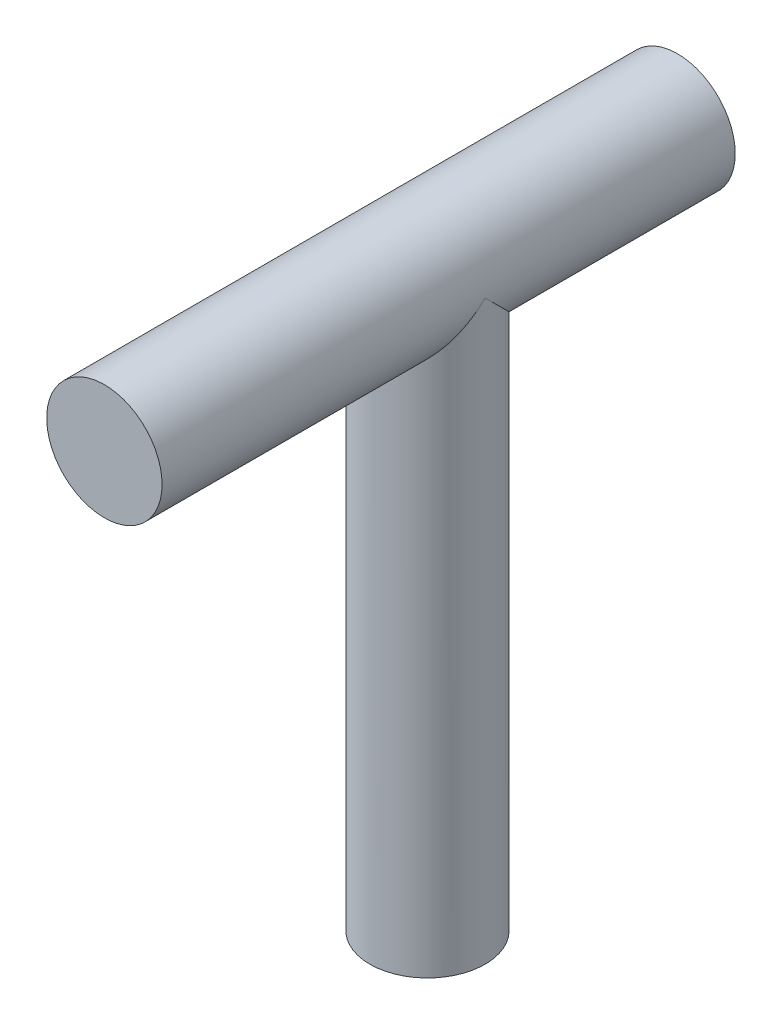
ISO-10303-21;
HEADER;
FILE_DESCRIPTION(('STEP AP214'),'2;1');
FILE_NAME('part.step','',(''),(''),'','','');
FILE_SCHEMA(('AUTOMOTIVE_DESIGN { 1 0 10303 214 1 1 1 1 }'));
ENDSEC;
DATA;
#1=APPLICATION_CONTEXT('core data for automotive mechanical design processes');
#2=APPLICATION_PROTOCOL_DEFINITION('international standard','automotive_design',2000,#1);
#3=PRODUCT_CONTEXT('',#1,'mechanical');
#4=PRODUCT('Part','Part','',(#3));
#5=PRODUCT_RELATED_PRODUCT_CATEGORY('part','',(#4));
#6=PRODUCT_DEFINITION_FORMATION('','',#4);
#7=PRODUCT_DEFINITION_CONTEXT('part definition',#1,'design');
#8=PRODUCT_DEFINITION('design','',#6,#7);
#9=PRODUCT_DEFINITION_SHAPE('','',#8);
#10=(LENGTH_UNIT() NAMED_UNIT(*) SI_UNIT(.MILLI.,.METRE.));
#11=(NAMED_UNIT(*) PLANE_ANGLE_UNIT() SI_UNIT($,.RADIAN.));
#12=(NAMED_UNIT(*) SI_UNIT($,.STERADIAN.) SOLID_ANGLE_UNIT());
#13=UNCERTAINTY_MEASURE_WITH_UNIT(LENGTH_MEASURE(1.E-05),#10,'distance_accuracy_value','');
#14=(GEOMETRIC_REPRESENTATION_CONTEXT(3) GLOBAL_UNCERTAINTY_ASSIGNED_CONTEXT((#13)) GLOBAL_UNIT_ASSIGNED_CONTEXT((#10,
#11,#12)) REPRESENTATION_CONTEXT('',''));
#15=CARTESIAN_POINT('',(0.,0.,0.));
#16=DIRECTION('',(0.,0.,1.));
#17=DIRECTION('',(1.,0.,0.));
#18=AXIS2_PLACEMENT_3D('',#15,#16,#17);
#19=CARTESIAN_POINT('',(0.,150.,-64.9999999999999));
#20=DIRECTION('',(0.,0.,1.));
#21=DIRECTION('',(1.,0.,0.));
#22=AXIS2_PLACEMENT_3D('',#19,#20,#21);
#23=CYLINDRICAL_SURFACE('',#22,15.);
#24=CARTESIAN_POINT('',(0.,150.,84.));
#25=DIRECTION('',(0.,0.,1.));
#26=DIRECTION('',(1.,0.,0.));
#27=AXIS2_PLACEMENT_3D('',#24,#25,#26);
#28=CIRCLE('',#27,15.);
#29=CARTESIAN_POINT('',(15.,150.,84.));
#30=VERTEX_POINT('',#29);
#31=EDGE_CURVE('E66',#30,#30,#28,.T.);
#32=ORIENTED_EDGE('',*,*,#31,.F.);
#33=EDGE_LOOP('',(#32));
#34=FACE_BOUND('',#33,.T.);
#35=CARTESIAN_POINT('',(0.,150.,-64.9999999999999));
#36=DIRECTION('',(0.,0.,1.));
#37=DIRECTION('',(1.,0.,0.));
#38=AXIS2_PLACEMENT_3D('',#35,#36,#37);
#39=CIRCLE('',#38,15.);
#40=CARTESIAN_POINT('',(15.,150.,-64.9999999999999));
#41=VERTEX_POINT('',#40);
#42=EDGE_CURVE('E58',#41,#41,#39,.T.);
#43=ORIENTED_EDGE('',*,*,#42,.T.);
#44=EDGE_LOOP('',(#43));
#45=FACE_BOUND('',#44,.T.);
#46=CARTESIAN_POINT('',(0.,150.,0.));
#47=DIRECTION('',(0.,-0.707106781186547,0.707106781186547));
#48=DIRECTION('',(0.,-0.707106781186547,-0.707106781186547));
#49=AXIS2_PLACEMENT_3D('',#46,#47,#48);
#50=ELLIPSE('',#49,21.2132034355964,15.);
#51=CARTESIAN_POINT('',(-15.,150.,0.));
#52=VERTEX_POINT('',#51);
#53=CARTESIAN_POINT('',(15.,150.,0.));
#54=VERTEX_POINT('',#53);
#55=EDGE_CURVE('E48',#52,#54,#50,.T.);
#56=ORIENTED_EDGE('',*,*,#55,.F.);
#57=CARTESIAN_POINT('',(0.,150.,0.));
#58=DIRECTION('',(0.,-0.707106781186547,-0.707106781186547));
#59=DIRECTION('',(0.,-0.707106781186547,0.707106781186547));
#60=AXIS2_PLACEMENT_3D('',#57,#58,#59);
#61=ELLIPSE('',#60,21.2132034355964,15.);
#62=EDGE_CURVE('E55',#54,#52,#61,.T.);
#63=ORIENTED_EDGE('',*,*,#62,.F.);
#64=EDGE_LOOP('',(#56,#63));
#65=FACE_BOUND('',#64,.T.);
#66=ADVANCED_FACE('F39',(#34,#45,#65),#23,.T.);
#67=CARTESIAN_POINT('',(0.,150.,-64.9999999999999));
#68=DIRECTION('',(0.,0.,1.));
#69=DIRECTION('',(1.,0.,0.));
#70=AXIS2_PLACEMENT_3D('',#67,#68,#69);
#71=PLANE('',#70);
#72=ORIENTED_EDGE('',*,*,#42,.F.);
#73=EDGE_LOOP('',(#72));
#74=FACE_BOUND('',#73,.T.);
#75=ADVANCED_FACE('F75',(#74),#71,.F.);
#76=CARTESIAN_POINT('',(0.,150.,84.));
#77=DIRECTION('',(0.,0.,1.));
#78=DIRECTION('',(1.,0.,0.));
#79=AXIS2_PLACEMENT_3D('',#76,#77,#78);
#80=PLANE('',#79);
#81=ORIENTED_EDGE('',*,*,#31,.T.);
#82=EDGE_LOOP('',(#81));
#83=FACE_BOUND('',#82,.T.);
#84=ADVANCED_FACE('F71',(#83),#80,.T.);
#85=CARTESIAN_POINT('',(0.,150.,0.));
#86=DIRECTION('',(0.,-1.,0.));
#87=DIRECTION('',(0.,0.,-1.));
#88=AXIS2_PLACEMENT_3D('',#85,#86,#87);
#89=CYLINDRICAL_SURFACE('',#88,15.);
#90=ORIENTED_EDGE('',*,*,#62,.T.);
#91=ORIENTED_EDGE('',*,*,#55,.T.);
#92=EDGE_LOOP('',(#90,#91));
#93=FACE_BOUND('',#92,.T.);
#94=CARTESIAN_POINT('',(0.,0.,0.));
#95=DIRECTION('',(0.,1.,0.));
#96=DIRECTION('',(0.,0.,1.));
#97=AXIS2_PLACEMENT_3D('',#94,#95,#96);
#98=CIRCLE('',#97,15.);
#99=CARTESIAN_POINT('',(0.,0.,15.));
#100=VERTEX_POINT('',#99);
#101=EDGE_CURVE('E11',#100,#100,#98,.T.);
#102=ORIENTED_EDGE('',*,*,#101,.T.);
#103=EDGE_LOOP('',(#102));
#104=FACE_BOUND('',#103,.T.);
#105=ADVANCED_FACE('F41',(#93,#104),#89,.T.);
#106=CARTESIAN_POINT('',(0.,0.,0.));
#107=DIRECTION('',(0.,1.,0.));
#108=DIRECTION('',(0.,0.,1.));
#109=AXIS2_PLACEMENT_3D('',#106,#107,#108);
#110=PLANE('',#109);
#111=ORIENTED_EDGE('',*,*,#101,.F.);
#112=EDGE_LOOP('',(#111));
#113=FACE_BOUND('',#112,.T.);
#114=ADVANCED_FACE('F85',(#113),#110,.F.);
#115=CLOSED_SHELL('',(#66,#75,#84,#105,#114));
#116=MANIFOLD_SOLID_BREP('B2',#115);
#117=ADVANCED_BREP_SHAPE_REPRESENTATION('',(#18,#116),#14);
#118=SHAPE_DEFINITION_REPRESENTATION(#9,#117);
ENDSEC;
END-ISO-10303-21;
